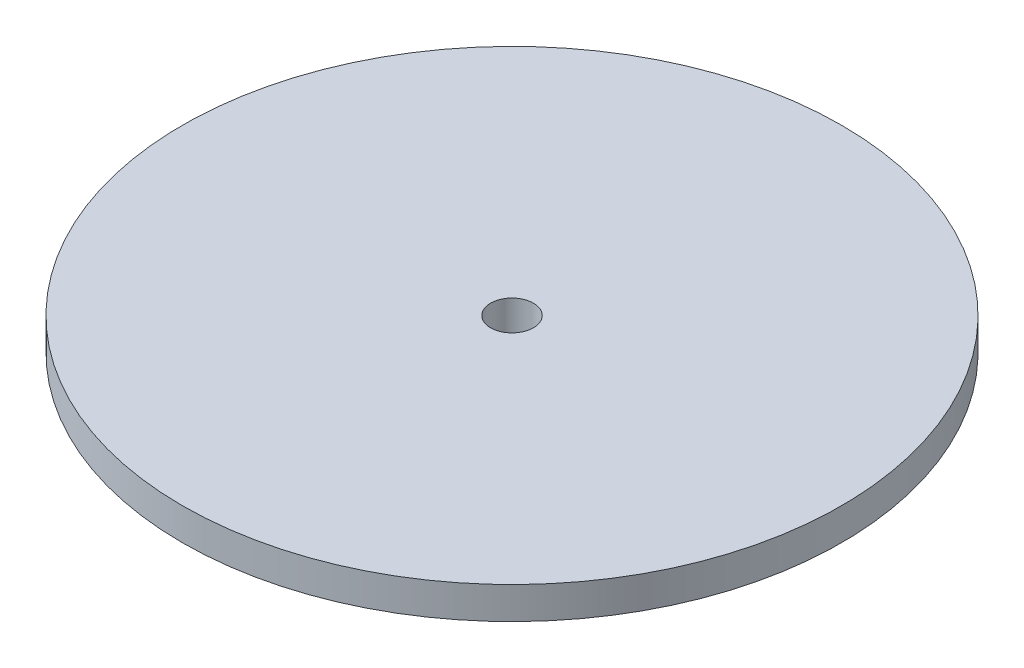
ISO-10303-21;
HEADER;
FILE_DESCRIPTION(('STEP AP214'),'2;1');
FILE_NAME('part.step','',(''),(''),'','','');
FILE_SCHEMA(('AUTOMOTIVE_DESIGN { 1 0 10303 214 1 1 1 1 }'));
ENDSEC;
DATA;
#1=APPLICATION_CONTEXT('core data for automotive mechanical design processes');
#2=APPLICATION_PROTOCOL_DEFINITION('international standard','automotive_design',2000,#1);
#3=PRODUCT_CONTEXT('',#1,'mechanical');
#4=PRODUCT('Part','Part','',(#3));
#5=PRODUCT_RELATED_PRODUCT_CATEGORY('part','',(#4));
#6=PRODUCT_DEFINITION_FORMATION('','',#4);
#7=PRODUCT_DEFINITION_CONTEXT('part definition',#1,'design');
#8=PRODUCT_DEFINITION('design','',#6,#7);
#9=PRODUCT_DEFINITION_SHAPE('','',#8);
#10=(LENGTH_UNIT() NAMED_UNIT(*) SI_UNIT(.MILLI.,.METRE.));
#11=(NAMED_UNIT(*) PLANE_ANGLE_UNIT() SI_UNIT($,.RADIAN.));
#12=(NAMED_UNIT(*) SI_UNIT($,.STERADIAN.) SOLID_ANGLE_UNIT());
#13=UNCERTAINTY_MEASURE_WITH_UNIT(LENGTH_MEASURE(1.E-05),#10,'distance_accuracy_value','');
#14=(GEOMETRIC_REPRESENTATION_CONTEXT(3) GLOBAL_UNCERTAINTY_ASSIGNED_CONTEXT((#13)) GLOBAL_UNIT_ASSIGNED_CONTEXT((#10,
#11,#12)) REPRESENTATION_CONTEXT('',''));
#15=CARTESIAN_POINT('',(0.,0.,0.));
#16=DIRECTION('',(0.,0.,1.));
#17=DIRECTION('',(1.,0.,0.));
#18=AXIS2_PLACEMENT_3D('',#15,#16,#17);
#19=CARTESIAN_POINT('',(0.,3.,0.));
#20=DIRECTION('',(0.,1.,0.));
#21=DIRECTION('',(0.,0.,1.));
#22=AXIS2_PLACEMENT_3D('',#19,#20,#21);
#23=PLANE('',#22);
#24=CARTESIAN_POINT('',(0.,3.,0.));
#25=DIRECTION('',(0.,1.,0.));
#26=DIRECTION('',(0.,0.,1.));
#27=AXIS2_PLACEMENT_3D('',#24,#25,#26);
#28=CIRCLE('',#27,30.8);
#29=CARTESIAN_POINT('',(0.,3.,30.8));
#30=VERTEX_POINT('',#29);
#31=EDGE_CURVE('E10',#30,#30,#28,.T.);
#32=ORIENTED_EDGE('',*,*,#31,.T.);
#33=EDGE_LOOP('',(#32));
#34=FACE_BOUND('',#33,.T.);
#35=CARTESIAN_POINT('',(0.,3.,0.));
#36=DIRECTION('',(0.,1.,0.));
#37=DIRECTION('',(0.,0.,1.));
#38=AXIS2_PLACEMENT_3D('',#35,#36,#37);
#39=CIRCLE('',#38,2.);
#40=CARTESIAN_POINT('',(0.,3.,2.));
#41=VERTEX_POINT('',#40);
#42=EDGE_CURVE('E43',#41,#41,#39,.T.);
#43=ORIENTED_EDGE('',*,*,#42,.F.);
#44=EDGE_LOOP('',(#43));
#45=FACE_BOUND('',#44,.T.);
#46=ADVANCED_FACE('F32',(#34,#45),#23,.T.);
#47=CARTESIAN_POINT('',(0.,0.,0.));
#48=DIRECTION('',(0.,1.,0.));
#49=DIRECTION('',(0.,0.,1.));
#50=AXIS2_PLACEMENT_3D('',#47,#48,#49);
#51=PLANE('',#50);
#52=CARTESIAN_POINT('',(0.,0.,0.));
#53=DIRECTION('',(0.,1.,0.));
#54=DIRECTION('',(0.,0.,1.));
#55=AXIS2_PLACEMENT_3D('',#52,#53,#54);
#56=CIRCLE('',#55,30.8);
#57=CARTESIAN_POINT('',(0.,0.,30.8));
#58=VERTEX_POINT('',#57);
#59=EDGE_CURVE('E36',#58,#58,#56,.T.);
#60=ORIENTED_EDGE('',*,*,#59,.F.);
#61=EDGE_LOOP('',(#60));
#62=FACE_BOUND('',#61,.T.);
#63=CARTESIAN_POINT('',(0.,0.,0.));
#64=DIRECTION('',(0.,1.,0.));
#65=DIRECTION('',(0.,0.,1.));
#66=AXIS2_PLACEMENT_3D('',#63,#64,#65);
#67=CIRCLE('',#66,2.);
#68=CARTESIAN_POINT('',(0.,0.,2.));
#69=VERTEX_POINT('',#68);
#70=EDGE_CURVE('E45',#69,#69,#67,.T.);
#71=ORIENTED_EDGE('',*,*,#70,.T.);
#72=EDGE_LOOP('',(#71));
#73=FACE_BOUND('',#72,.T.);
#74=ADVANCED_FACE('F55',(#62,#73),#51,.F.);
#75=CARTESIAN_POINT('',(0.,3.,0.));
#76=DIRECTION('',(0.,-1.,0.));
#77=DIRECTION('',(0.,0.,-1.));
#78=AXIS2_PLACEMENT_3D('',#75,#76,#77);
#79=CYLINDRICAL_SURFACE('',#78,30.8);
#80=ORIENTED_EDGE('',*,*,#31,.F.);
#81=EDGE_LOOP('',(#80));
#82=FACE_BOUND('',#81,.T.);
#83=ORIENTED_EDGE('',*,*,#59,.T.);
#84=EDGE_LOOP('',(#83));
#85=FACE_BOUND('',#84,.T.);
#86=ADVANCED_FACE('F34',(#82,#85),#79,.T.);
#87=CARTESIAN_POINT('',(0.,3.,0.));
#88=DIRECTION('',(0.,-1.,0.));
#89=DIRECTION('',(0.,0.,-1.));
#90=AXIS2_PLACEMENT_3D('',#87,#88,#89);
#91=CYLINDRICAL_SURFACE('',#90,2.);
#92=ORIENTED_EDGE('',*,*,#42,.T.);
#93=EDGE_LOOP('',(#92));
#94=FACE_BOUND('',#93,.T.);
#95=ORIENTED_EDGE('',*,*,#70,.F.);
#96=EDGE_LOOP('',(#95));
#97=FACE_BOUND('',#96,.T.);
#98=ADVANCED_FACE('F51',(#94,#97),#91,.F.);
#99=CLOSED_SHELL('',(#46,#74,#86,#98));
#100=MANIFOLD_SOLID_BREP('B2',#99);
#101=ADVANCED_BREP_SHAPE_REPRESENTATION('',(#18,#100),#14);
#102=SHAPE_DEFINITION_REPRESENTATION(#9,#101);
ENDSEC;
END-ISO-10303-21;
